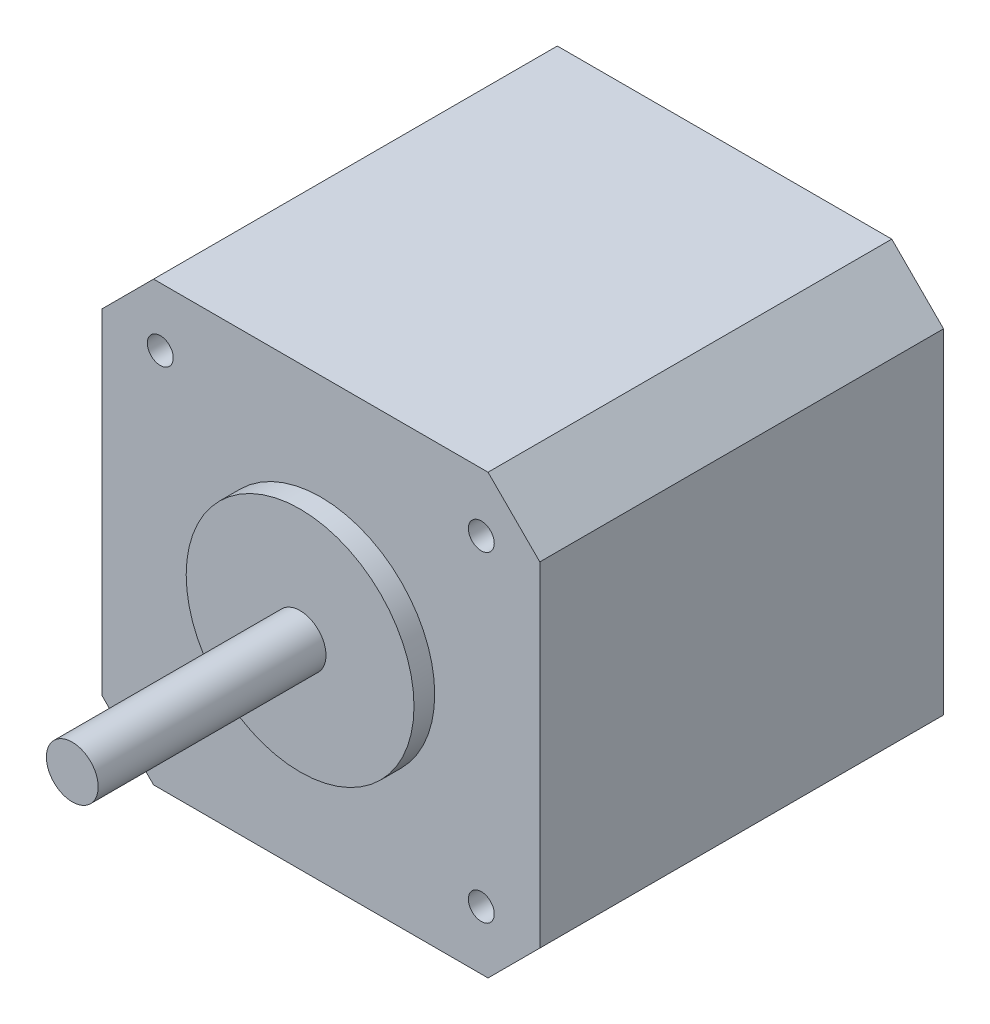
ISO-10303-21;
HEADER;
FILE_DESCRIPTION(('STEP AP214'),'2;1');
FILE_NAME('part.step','',(''),(''),'','','');
FILE_SCHEMA(('AUTOMOTIVE_DESIGN { 1 0 10303 214 1 1 1 1 }'));
ENDSEC;
DATA;
#1=APPLICATION_CONTEXT('core data for automotive mechanical design processes');
#2=APPLICATION_PROTOCOL_DEFINITION('international standard','automotive_design',2000,#1);
#3=PRODUCT_CONTEXT('',#1,'mechanical');
#4=PRODUCT('Part','Part','',(#3));
#5=PRODUCT_RELATED_PRODUCT_CATEGORY('part','',(#4));
#6=PRODUCT_DEFINITION_FORMATION('','',#4);
#7=PRODUCT_DEFINITION_CONTEXT('part definition',#1,'design');
#8=PRODUCT_DEFINITION('design','',#6,#7);
#9=PRODUCT_DEFINITION_SHAPE('','',#8);
#10=(LENGTH_UNIT() NAMED_UNIT(*) SI_UNIT(.MILLI.,.METRE.));
#11=(NAMED_UNIT(*) PLANE_ANGLE_UNIT() SI_UNIT($,.RADIAN.));
#12=(NAMED_UNIT(*) SI_UNIT($,.STERADIAN.) SOLID_ANGLE_UNIT());
#13=UNCERTAINTY_MEASURE_WITH_UNIT(LENGTH_MEASURE(1.E-05),#10,'distance_accuracy_value','');
#14=(GEOMETRIC_REPRESENTATION_CONTEXT(3) GLOBAL_UNCERTAINTY_ASSIGNED_CONTEXT((#13)) GLOBAL_UNIT_ASSIGNED_CONTEXT((#10,
#11,#12)) REPRESENTATION_CONTEXT('',''));
#15=CARTESIAN_POINT('',(0.,0.,0.));
#16=DIRECTION('',(0.,0.,1.));
#17=DIRECTION('',(1.,0.,0.));
#18=AXIS2_PLACEMENT_3D('',#15,#16,#17);
#19=CARTESIAN_POINT('',(0.,5.,38.989));
#20=DIRECTION('',(1.,0.,0.));
#21=DIRECTION('',(0.,0.,-1.));
#22=AXIS2_PLACEMENT_3D('',#19,#20,#21);
#23=PLANE('',#22);
#24=DIRECTION('',(0.,-1.,0.));
#25=VECTOR('',#24,1.);
#26=CARTESIAN_POINT('',(0.,5.,0.));
#27=LINE('',#26,#25);
#28=CARTESIAN_POINT('',(0.,37.3,0.));
#29=VERTEX_POINT('',#28);
#30=CARTESIAN_POINT('',(0.,5.,0.));
#31=VERTEX_POINT('',#30);
#32=EDGE_CURVE('E137',#29,#31,#27,.T.);
#33=ORIENTED_EDGE('',*,*,#32,.T.);
#34=DIRECTION('',(0.,0.,-1.));
#35=VECTOR('',#34,1.);
#36=CARTESIAN_POINT('',(0.,5.,38.989));
#37=LINE('',#36,#35);
#38=CARTESIAN_POINT('',(0.,5.,38.989));
#39=VERTEX_POINT('',#38);
#40=EDGE_CURVE('E45',#39,#31,#37,.T.);
#41=ORIENTED_EDGE('',*,*,#40,.F.);
#42=DIRECTION('',(0.,-1.,0.));
#43=VECTOR('',#42,1.);
#44=CARTESIAN_POINT('',(0.,5.,38.989));
#45=LINE('',#44,#43);
#46=CARTESIAN_POINT('',(0.,37.3,38.989));
#47=VERTEX_POINT('',#46);
#48=EDGE_CURVE('E152',#47,#39,#45,.T.);
#49=ORIENTED_EDGE('',*,*,#48,.F.);
#50=DIRECTION('',(0.,0.,-1.));
#51=VECTOR('',#50,1.);
#52=CARTESIAN_POINT('',(0.,37.3,38.989));
#53=LINE('',#52,#51);
#54=EDGE_CURVE('E133',#47,#29,#53,.T.);
#55=ORIENTED_EDGE('',*,*,#54,.T.);
#56=EDGE_LOOP('',(#33,#41,#49,#55));
#57=FACE_BOUND('',#56,.T.);
#58=ADVANCED_FACE('F37',(#57),#23,.F.);
#59=CARTESIAN_POINT('',(0.,5.,38.989));
#60=DIRECTION('',(0.707106781186548,0.707106781186548,0.));
#61=DIRECTION('',(-0.707106781186548,0.707106781186548,0.));
#62=AXIS2_PLACEMENT_3D('',#59,#60,#61);
#63=PLANE('',#62);
#64=DIRECTION('',(0.707106781186548,-0.707106781186548,0.));
#65=VECTOR('',#64,1.);
#66=CARTESIAN_POINT('',(0.,5.,0.));
#67=LINE('',#66,#65);
#68=CARTESIAN_POINT('',(5.,0.,0.));
#69=VERTEX_POINT('',#68);
#70=EDGE_CURVE('E140',#31,#69,#67,.T.);
#71=ORIENTED_EDGE('',*,*,#70,.T.);
#72=DIRECTION('',(0.,0.,-1.));
#73=VECTOR('',#72,1.);
#74=CARTESIAN_POINT('',(5.,0.,38.989));
#75=LINE('',#74,#73);
#76=CARTESIAN_POINT('',(5.,0.,38.989));
#77=VERTEX_POINT('',#76);
#78=EDGE_CURVE('E162',#77,#69,#75,.T.);
#79=ORIENTED_EDGE('',*,*,#78,.F.);
#80=DIRECTION('',(0.707106781186548,-0.707106781186548,0.));
#81=VECTOR('',#80,1.);
#82=CARTESIAN_POINT('',(0.,5.,38.989));
#83=LINE('',#82,#81);
#84=EDGE_CURVE('E98',#39,#77,#83,.T.);
#85=ORIENTED_EDGE('',*,*,#84,.F.);
#86=ORIENTED_EDGE('',*,*,#40,.T.);
#87=EDGE_LOOP('',(#71,#79,#85,#86));
#88=FACE_BOUND('',#87,.T.);
#89=ADVANCED_FACE('F165',(#88),#63,.F.);
#90=CARTESIAN_POINT('',(5.,0.,38.989));
#91=DIRECTION('',(0.,1.,0.));
#92=DIRECTION('',(0.,0.,1.));
#93=AXIS2_PLACEMENT_3D('',#90,#91,#92);
#94=PLANE('',#93);
#95=DIRECTION('',(1.,0.,0.));
#96=VECTOR('',#95,1.);
#97=CARTESIAN_POINT('',(5.,0.,0.));
#98=LINE('',#97,#96);
#99=CARTESIAN_POINT('',(37.3,0.,0.));
#100=VERTEX_POINT('',#99);
#101=EDGE_CURVE('E143',#69,#100,#98,.T.);
#102=ORIENTED_EDGE('',*,*,#101,.T.);
#103=DIRECTION('',(0.,0.,-1.));
#104=VECTOR('',#103,1.);
#105=CARTESIAN_POINT('',(37.3,0.,38.989));
#106=LINE('',#105,#104);
#107=CARTESIAN_POINT('',(37.3,0.,38.989));
#108=VERTEX_POINT('',#107);
#109=EDGE_CURVE('E159',#108,#100,#106,.T.);
#110=ORIENTED_EDGE('',*,*,#109,.F.);
#111=DIRECTION('',(1.,0.,0.));
#112=VECTOR('',#111,1.);
#113=CARTESIAN_POINT('',(5.,0.,38.989));
#114=LINE('',#113,#112);
#115=EDGE_CURVE('E183',#77,#108,#114,.T.);
#116=ORIENTED_EDGE('',*,*,#115,.F.);
#117=ORIENTED_EDGE('',*,*,#78,.T.);
#118=EDGE_LOOP('',(#102,#110,#116,#117));
#119=FACE_BOUND('',#118,.T.);
#120=ADVANCED_FACE('F176',(#119),#94,.F.);
#121=CARTESIAN_POINT('',(37.3,0.,38.989));
#122=DIRECTION('',(-0.707106781186548,0.707106781186547,0.));
#123=DIRECTION('',(-0.707106781186547,-0.707106781186548,0.));
#124=AXIS2_PLACEMENT_3D('',#121,#122,#123);
#125=PLANE('',#124);
#126=DIRECTION('',(0.707106781186547,0.707106781186548,0.));
#127=VECTOR('',#126,1.);
#128=CARTESIAN_POINT('',(37.3,0.,0.));
#129=LINE('',#128,#127);
#130=CARTESIAN_POINT('',(42.3,5.,0.));
#131=VERTEX_POINT('',#130);
#132=EDGE_CURVE('E145',#100,#131,#129,.T.);
#133=ORIENTED_EDGE('',*,*,#132,.T.);
#134=DIRECTION('',(0.,0.,-1.));
#135=VECTOR('',#134,1.);
#136=CARTESIAN_POINT('',(42.3,5.,38.989));
#137=LINE('',#136,#135);
#138=CARTESIAN_POINT('',(42.3,5.,38.989));
#139=VERTEX_POINT('',#138);
#140=EDGE_CURVE('E156',#139,#131,#137,.T.);
#141=ORIENTED_EDGE('',*,*,#140,.F.);
#142=DIRECTION('',(0.707106781186547,0.707106781186548,0.));
#143=VECTOR('',#142,1.);
#144=CARTESIAN_POINT('',(37.3,0.,38.989));
#145=LINE('',#144,#143);
#146=EDGE_CURVE('E182',#108,#139,#145,.T.);
#147=ORIENTED_EDGE('',*,*,#146,.F.);
#148=ORIENTED_EDGE('',*,*,#109,.T.);
#149=EDGE_LOOP('',(#133,#141,#147,#148));
#150=FACE_BOUND('',#149,.T.);
#151=ADVANCED_FACE('F180',(#150),#125,.F.);
#152=CARTESIAN_POINT('',(42.3,5.,38.989));
#153=DIRECTION('',(-1.,0.,0.));
#154=DIRECTION('',(0.,0.,1.));
#155=AXIS2_PLACEMENT_3D('',#152,#153,#154);
#156=PLANE('',#155);
#157=DIRECTION('',(0.,1.,0.));
#158=VECTOR('',#157,1.);
#159=CARTESIAN_POINT('',(42.3,5.,0.));
#160=LINE('',#159,#158);
#161=CARTESIAN_POINT('',(42.3,37.3,0.));
#162=VERTEX_POINT('',#161);
#163=EDGE_CURVE('E147',#131,#162,#160,.T.);
#164=ORIENTED_EDGE('',*,*,#163,.T.);
#165=DIRECTION('',(0.,0.,-1.));
#166=VECTOR('',#165,1.);
#167=CARTESIAN_POINT('',(42.3,37.3,38.989));
#168=LINE('',#167,#166);
#169=CARTESIAN_POINT('',(42.3,37.3,38.989));
#170=VERTEX_POINT('',#169);
#171=EDGE_CURVE('E128',#170,#162,#168,.T.);
#172=ORIENTED_EDGE('',*,*,#171,.F.);
#173=DIRECTION('',(0.,1.,0.));
#174=VECTOR('',#173,1.);
#175=CARTESIAN_POINT('',(42.3,5.,38.989));
#176=LINE('',#175,#174);
#177=EDGE_CURVE('E119',#139,#170,#176,.T.);
#178=ORIENTED_EDGE('',*,*,#177,.F.);
#179=ORIENTED_EDGE('',*,*,#140,.T.);
#180=EDGE_LOOP('',(#164,#172,#178,#179));
#181=FACE_BOUND('',#180,.T.);
#182=ADVANCED_FACE('F282',(#181),#156,.F.);
#183=CARTESIAN_POINT('',(37.3,42.3,38.989));
#184=DIRECTION('',(-0.707106781186548,-0.707106781186548,0.));
#185=DIRECTION('',(0.707106781186548,-0.707106781186548,0.));
#186=AXIS2_PLACEMENT_3D('',#183,#184,#185);
#187=PLANE('',#186);
#188=DIRECTION('',(-0.707106781186547,0.707106781186547,0.));
#189=VECTOR('',#188,1.);
#190=CARTESIAN_POINT('',(37.3,42.3,0.));
#191=LINE('',#190,#189);
#192=CARTESIAN_POINT('',(37.3,42.3,0.));
#193=VERTEX_POINT('',#192);
#194=EDGE_CURVE('E127',#162,#193,#191,.T.);
#195=ORIENTED_EDGE('',*,*,#194,.T.);
#196=DIRECTION('',(0.,0.,-1.));
#197=VECTOR('',#196,1.);
#198=CARTESIAN_POINT('',(37.3,42.3,38.989));
#199=LINE('',#198,#197);
#200=CARTESIAN_POINT('',(37.3,42.3,38.989));
#201=VERTEX_POINT('',#200);
#202=EDGE_CURVE('E124',#201,#193,#199,.T.);
#203=ORIENTED_EDGE('',*,*,#202,.F.);
#204=DIRECTION('',(-0.707106781186547,0.707106781186547,0.));
#205=VECTOR('',#204,1.);
#206=CARTESIAN_POINT('',(37.3,42.3,38.989));
#207=LINE('',#206,#205);
#208=EDGE_CURVE('E113',#170,#201,#207,.T.);
#209=ORIENTED_EDGE('',*,*,#208,.F.);
#210=ORIENTED_EDGE('',*,*,#171,.T.);
#211=EDGE_LOOP('',(#195,#203,#209,#210));
#212=FACE_BOUND('',#211,.T.);
#213=ADVANCED_FACE('F125',(#212),#187,.F.);
#214=CARTESIAN_POINT('',(5.,42.3,38.989));
#215=DIRECTION('',(0.,-1.,0.));
#216=DIRECTION('',(0.,0.,-1.));
#217=AXIS2_PLACEMENT_3D('',#214,#215,#216);
#218=PLANE('',#217);
#219=DIRECTION('',(-1.,0.,0.));
#220=VECTOR('',#219,1.);
#221=CARTESIAN_POINT('',(5.,42.3,0.));
#222=LINE('',#221,#220);
#223=CARTESIAN_POINT('',(5.,42.3,0.));
#224=VERTEX_POINT('',#223);
#225=EDGE_CURVE('E83',#193,#224,#222,.T.);
#226=ORIENTED_EDGE('',*,*,#225,.T.);
#227=DIRECTION('',(0.,0.,-1.));
#228=VECTOR('',#227,1.);
#229=CARTESIAN_POINT('',(5.,42.3,38.989));
#230=LINE('',#229,#228);
#231=CARTESIAN_POINT('',(5.,42.3,38.989));
#232=VERTEX_POINT('',#231);
#233=EDGE_CURVE('E129',#232,#224,#230,.T.);
#234=ORIENTED_EDGE('',*,*,#233,.F.);
#235=DIRECTION('',(-1.,0.,0.));
#236=VECTOR('',#235,1.);
#237=CARTESIAN_POINT('',(5.,42.3,38.989));
#238=LINE('',#237,#236);
#239=EDGE_CURVE('E117',#201,#232,#238,.T.);
#240=ORIENTED_EDGE('',*,*,#239,.F.);
#241=ORIENTED_EDGE('',*,*,#202,.T.);
#242=EDGE_LOOP('',(#226,#234,#240,#241));
#243=FACE_BOUND('',#242,.T.);
#244=ADVANCED_FACE('F131',(#243),#218,.F.);
#245=CARTESIAN_POINT('',(0.,37.3,38.989));
#246=DIRECTION('',(0.707106781186547,-0.707106781186548,0.));
#247=DIRECTION('',(0.707106781186548,0.707106781186547,0.));
#248=AXIS2_PLACEMENT_3D('',#245,#246,#247);
#249=PLANE('',#248);
#250=DIRECTION('',(-0.707106781186548,-0.707106781186547,0.));
#251=VECTOR('',#250,1.);
#252=CARTESIAN_POINT('',(0.,37.3,0.));
#253=LINE('',#252,#251);
#254=EDGE_CURVE('E89',#224,#29,#253,.T.);
#255=ORIENTED_EDGE('',*,*,#254,.T.);
#256=ORIENTED_EDGE('',*,*,#54,.F.);
#257=DIRECTION('',(-0.707106781186548,-0.707106781186547,0.));
#258=VECTOR('',#257,1.);
#259=CARTESIAN_POINT('',(0.,37.3,38.989));
#260=LINE('',#259,#258);
#261=EDGE_CURVE('E53',#232,#47,#260,.T.);
#262=ORIENTED_EDGE('',*,*,#261,.F.);
#263=ORIENTED_EDGE('',*,*,#233,.T.);
#264=EDGE_LOOP('',(#255,#256,#262,#263));
#265=FACE_BOUND('',#264,.T.);
#266=ADVANCED_FACE('F245',(#265),#249,.F.);
#267=CARTESIAN_POINT('',(0.,0.,38.989));
#268=DIRECTION('',(0.,0.,-1.));
#269=DIRECTION('',(-1.,0.,0.));
#270=AXIS2_PLACEMENT_3D('',#267,#268,#269);
#271=PLANE('',#270);
#272=CARTESIAN_POINT('',(21.15,21.15,38.989));
#273=DIRECTION('',(0.,0.,-1.));
#274=DIRECTION('',(-1.,0.,0.));
#275=AXIS2_PLACEMENT_3D('',#272,#273,#274);
#276=CIRCLE('',#275,11.);
#277=CARTESIAN_POINT('',(10.15,21.15,38.989));
#278=VERTEX_POINT('',#277);
#279=EDGE_CURVE('E11',#278,#278,#276,.F.);
#280=ORIENTED_EDGE('',*,*,#279,.F.);
#281=EDGE_LOOP('',(#280));
#282=FACE_BOUND('',#281,.T.);
#283=CARTESIAN_POINT('',(5.65,36.65,38.989));
#284=DIRECTION('',(0.,0.,1.));
#285=DIRECTION('',(1.,0.,0.));
#286=AXIS2_PLACEMENT_3D('',#283,#284,#285);
#287=CIRCLE('',#286,1.25);
#288=CARTESIAN_POINT('',(6.9,36.65,38.989));
#289=VERTEX_POINT('',#288);
#290=EDGE_CURVE('E209',#289,#289,#287,.T.);
#291=ORIENTED_EDGE('',*,*,#290,.F.);
#292=EDGE_LOOP('',(#291));
#293=FACE_BOUND('',#292,.T.);
#294=CARTESIAN_POINT('',(36.65,36.65,38.989));
#295=DIRECTION('',(0.,0.,1.));
#296=DIRECTION('',(1.,0.,0.));
#297=AXIS2_PLACEMENT_3D('',#294,#295,#296);
#298=CIRCLE('',#297,1.25);
#299=CARTESIAN_POINT('',(37.9,36.65,38.989));
#300=VERTEX_POINT('',#299);
#301=EDGE_CURVE('E203',#300,#300,#298,.T.);
#302=ORIENTED_EDGE('',*,*,#301,.F.);
#303=EDGE_LOOP('',(#302));
#304=FACE_BOUND('',#303,.T.);
#305=CARTESIAN_POINT('',(36.65,5.65,38.989));
#306=DIRECTION('',(0.,0.,1.));
#307=DIRECTION('',(1.,0.,0.));
#308=AXIS2_PLACEMENT_3D('',#305,#306,#307);
#309=CIRCLE('',#308,1.25);
#310=CARTESIAN_POINT('',(37.9,5.65,38.989));
#311=VERTEX_POINT('',#310);
#312=EDGE_CURVE('E197',#311,#311,#309,.T.);
#313=ORIENTED_EDGE('',*,*,#312,.F.);
#314=EDGE_LOOP('',(#313));
#315=FACE_BOUND('',#314,.T.);
#316=CARTESIAN_POINT('',(5.65,5.65,38.989));
#317=DIRECTION('',(0.,0.,1.));
#318=DIRECTION('',(1.,0.,0.));
#319=AXIS2_PLACEMENT_3D('',#316,#317,#318);
#320=CIRCLE('',#319,1.25);
#321=CARTESIAN_POINT('',(6.9,5.65,38.989));
#322=VERTEX_POINT('',#321);
#323=EDGE_CURVE('E191',#322,#322,#320,.T.);
#324=ORIENTED_EDGE('',*,*,#323,.F.);
#325=EDGE_LOOP('',(#324));
#326=FACE_BOUND('',#325,.T.);
#327=ORIENTED_EDGE('',*,*,#48,.T.);
#328=ORIENTED_EDGE('',*,*,#84,.T.);
#329=ORIENTED_EDGE('',*,*,#115,.T.);
#330=ORIENTED_EDGE('',*,*,#146,.T.);
#331=ORIENTED_EDGE('',*,*,#177,.T.);
#332=ORIENTED_EDGE('',*,*,#208,.T.);
#333=ORIENTED_EDGE('',*,*,#239,.T.);
#334=ORIENTED_EDGE('',*,*,#261,.T.);
#335=EDGE_LOOP('',(#327,#328,#329,#330,#331,#332,#333,#334));
#336=FACE_BOUND('',#335,.T.);
#337=ADVANCED_FACE('F115',(#282,#293,#304,#315,#326,#336),#271,.F.);
#338=CARTESIAN_POINT('',(0.,0.,0.));
#339=DIRECTION('',(0.,0.,-1.));
#340=DIRECTION('',(-1.,0.,0.));
#341=AXIS2_PLACEMENT_3D('',#338,#339,#340);
#342=PLANE('',#341);
#343=ORIENTED_EDGE('',*,*,#32,.F.);
#344=ORIENTED_EDGE('',*,*,#254,.F.);
#345=ORIENTED_EDGE('',*,*,#225,.F.);
#346=ORIENTED_EDGE('',*,*,#194,.F.);
#347=ORIENTED_EDGE('',*,*,#163,.F.);
#348=ORIENTED_EDGE('',*,*,#132,.F.);
#349=ORIENTED_EDGE('',*,*,#101,.F.);
#350=ORIENTED_EDGE('',*,*,#70,.F.);
#351=EDGE_LOOP('',(#343,#344,#345,#346,#347,#348,#349,#350));
#352=FACE_BOUND('',#351,.T.);
#353=ADVANCED_FACE('F170',(#352),#342,.T.);
#354=CARTESIAN_POINT('',(5.65,5.65,33.989));
#355=DIRECTION('',(0.,0.,1.));
#356=DIRECTION('',(1.,0.,0.));
#357=AXIS2_PLACEMENT_3D('',#354,#355,#356);
#358=CONICAL_SURFACE('',#357,1.25,1.02974425867665);
#359=CARTESIAN_POINT('',(5.65,5.65,33.2379242262155));
#360=VERTEX_POINT('',#359);
#361=VERTEX_LOOP('',#360);
#362=FACE_BOUND('',#361,.T.);
#363=CARTESIAN_POINT('',(5.65,5.65,33.989));
#364=DIRECTION('',(0.,0.,1.));
#365=DIRECTION('',(1.,0.,0.));
#366=AXIS2_PLACEMENT_3D('',#363,#364,#365);
#367=CIRCLE('',#366,1.25);
#368=CARTESIAN_POINT('',(6.9,5.65,33.989));
#369=VERTEX_POINT('',#368);
#370=EDGE_CURVE('E141',#369,#369,#367,.T.);
#371=ORIENTED_EDGE('',*,*,#370,.T.);
#372=EDGE_LOOP('',(#371));
#373=FACE_BOUND('',#372,.T.);
#374=ADVANCED_FACE('F258',(#362,#373),#358,.F.);
#375=CARTESIAN_POINT('',(5.65,5.65,38.989));
#376=DIRECTION('',(0.,0.,1.));
#377=DIRECTION('',(1.,0.,0.));
#378=AXIS2_PLACEMENT_3D('',#375,#376,#377);
#379=CYLINDRICAL_SURFACE('',#378,1.25);
#380=ORIENTED_EDGE('',*,*,#370,.F.);
#381=EDGE_LOOP('',(#380));
#382=FACE_BOUND('',#381,.T.);
#383=ORIENTED_EDGE('',*,*,#323,.T.);
#384=EDGE_LOOP('',(#383));
#385=FACE_BOUND('',#384,.T.);
#386=ADVANCED_FACE('F255',(#382,#385),#379,.F.);
#387=CARTESIAN_POINT('',(36.65,5.65,33.989));
#388=DIRECTION('',(0.,0.,1.));
#389=DIRECTION('',(1.,0.,0.));
#390=AXIS2_PLACEMENT_3D('',#387,#388,#389);
#391=CONICAL_SURFACE('',#390,1.25,1.02974425867666);
#392=CARTESIAN_POINT('',(36.65,5.65,33.2379242262155));
#393=VERTEX_POINT('',#392);
#394=VERTEX_LOOP('',#393);
#395=FACE_BOUND('',#394,.T.);
#396=CARTESIAN_POINT('',(36.65,5.65,33.989));
#397=DIRECTION('',(0.,0.,1.));
#398=DIRECTION('',(1.,0.,0.));
#399=AXIS2_PLACEMENT_3D('',#396,#397,#398);
#400=CIRCLE('',#399,1.25);
#401=CARTESIAN_POINT('',(37.9,5.65,33.989));
#402=VERTEX_POINT('',#401);
#403=EDGE_CURVE('E194',#402,#402,#400,.T.);
#404=ORIENTED_EDGE('',*,*,#403,.T.);
#405=EDGE_LOOP('',(#404));
#406=FACE_BOUND('',#405,.T.);
#407=ADVANCED_FACE('F257',(#395,#406),#391,.F.);
#408=CARTESIAN_POINT('',(36.65,5.65,38.989));
#409=DIRECTION('',(0.,0.,1.));
#410=DIRECTION('',(1.,0.,0.));
#411=AXIS2_PLACEMENT_3D('',#408,#409,#410);
#412=CYLINDRICAL_SURFACE('',#411,1.25);
#413=ORIENTED_EDGE('',*,*,#403,.F.);
#414=EDGE_LOOP('',(#413));
#415=FACE_BOUND('',#414,.T.);
#416=ORIENTED_EDGE('',*,*,#312,.T.);
#417=EDGE_LOOP('',(#416));
#418=FACE_BOUND('',#417,.T.);
#419=ADVANCED_FACE('F265',(#415,#418),#412,.F.);
#420=CARTESIAN_POINT('',(36.65,36.65,33.989));
#421=DIRECTION('',(0.,0.,1.));
#422=DIRECTION('',(1.,0.,0.));
#423=AXIS2_PLACEMENT_3D('',#420,#421,#422);
#424=CONICAL_SURFACE('',#423,1.25,1.02974425867666);
#425=CARTESIAN_POINT('',(36.65,36.65,33.2379242262155));
#426=VERTEX_POINT('',#425);
#427=VERTEX_LOOP('',#426);
#428=FACE_BOUND('',#427,.T.);
#429=CARTESIAN_POINT('',(36.65,36.65,33.989));
#430=DIRECTION('',(0.,0.,1.));
#431=DIRECTION('',(1.,0.,0.));
#432=AXIS2_PLACEMENT_3D('',#429,#430,#431);
#433=CIRCLE('',#432,1.25);
#434=CARTESIAN_POINT('',(37.9,36.65,33.989));
#435=VERTEX_POINT('',#434);
#436=EDGE_CURVE('E200',#435,#435,#433,.T.);
#437=ORIENTED_EDGE('',*,*,#436,.T.);
#438=EDGE_LOOP('',(#437));
#439=FACE_BOUND('',#438,.T.);
#440=ADVANCED_FACE('F324',(#428,#439),#424,.F.);
#441=CARTESIAN_POINT('',(36.65,36.65,38.989));
#442=DIRECTION('',(0.,0.,1.));
#443=DIRECTION('',(1.,0.,0.));
#444=AXIS2_PLACEMENT_3D('',#441,#442,#443);
#445=CYLINDRICAL_SURFACE('',#444,1.25);
#446=ORIENTED_EDGE('',*,*,#436,.F.);
#447=EDGE_LOOP('',(#446));
#448=FACE_BOUND('',#447,.T.);
#449=ORIENTED_EDGE('',*,*,#301,.T.);
#450=EDGE_LOOP('',(#449));
#451=FACE_BOUND('',#450,.T.);
#452=ADVANCED_FACE('F335',(#448,#451),#445,.F.);
#453=CARTESIAN_POINT('',(5.65,36.65,33.989));
#454=DIRECTION('',(0.,0.,1.));
#455=DIRECTION('',(1.,0.,0.));
#456=AXIS2_PLACEMENT_3D('',#453,#454,#455);
#457=CONICAL_SURFACE('',#456,1.25,1.02974425867665);
#458=CARTESIAN_POINT('',(5.65,36.65,33.2379242262155));
#459=VERTEX_POINT('',#458);
#460=VERTEX_LOOP('',#459);
#461=FACE_BOUND('',#460,.T.);
#462=CARTESIAN_POINT('',(5.65,36.65,33.989));
#463=DIRECTION('',(0.,0.,1.));
#464=DIRECTION('',(1.,0.,0.));
#465=AXIS2_PLACEMENT_3D('',#462,#463,#464);
#466=CIRCLE('',#465,1.25);
#467=CARTESIAN_POINT('',(6.9,36.65,33.989));
#468=VERTEX_POINT('',#467);
#469=EDGE_CURVE('E206',#468,#468,#466,.T.);
#470=ORIENTED_EDGE('',*,*,#469,.T.);
#471=EDGE_LOOP('',(#470));
#472=FACE_BOUND('',#471,.T.);
#473=ADVANCED_FACE('F345',(#461,#472),#457,.F.);
#474=CARTESIAN_POINT('',(5.65,36.65,38.989));
#475=DIRECTION('',(0.,0.,1.));
#476=DIRECTION('',(1.,0.,0.));
#477=AXIS2_PLACEMENT_3D('',#474,#475,#476);
#478=CYLINDRICAL_SURFACE('',#477,1.25);
#479=ORIENTED_EDGE('',*,*,#469,.F.);
#480=EDGE_LOOP('',(#479));
#481=FACE_BOUND('',#480,.T.);
#482=ORIENTED_EDGE('',*,*,#290,.T.);
#483=EDGE_LOOP('',(#482));
#484=FACE_BOUND('',#483,.T.);
#485=ADVANCED_FACE('F239',(#481,#484),#478,.F.);
#486=CARTESIAN_POINT('',(21.15,21.15,40.989));
#487=DIRECTION('',(0.,0.,-1.));
#488=DIRECTION('',(-1.,0.,0.));
#489=AXIS2_PLACEMENT_3D('',#486,#487,#488);
#490=CYLINDRICAL_SURFACE('',#489,11.);
#491=CARTESIAN_POINT('',(21.15,21.15,40.989));
#492=DIRECTION('',(0.,0.,1.));
#493=DIRECTION('',(1.,0.,0.));
#494=AXIS2_PLACEMENT_3D('',#491,#492,#493);
#495=CIRCLE('',#494,11.);
#496=CARTESIAN_POINT('',(32.15,21.15,40.989));
#497=VERTEX_POINT('',#496);
#498=EDGE_CURVE('E212',#497,#497,#495,.T.);
#499=ORIENTED_EDGE('',*,*,#498,.F.);
#500=EDGE_LOOP('',(#499));
#501=FACE_BOUND('',#500,.T.);
#502=ORIENTED_EDGE('',*,*,#279,.T.);
#503=EDGE_LOOP('',(#502));
#504=FACE_BOUND('',#503,.T.);
#505=ADVANCED_FACE('F233',(#501,#504),#490,.T.);
#506=CARTESIAN_POINT('',(21.15,21.15,40.989));
#507=DIRECTION('',(0.,0.,1.));
#508=DIRECTION('',(1.,0.,0.));
#509=AXIS2_PLACEMENT_3D('',#506,#507,#508);
#510=PLANE('',#509);
#511=CARTESIAN_POINT('',(21.15,21.15,40.989));
#512=DIRECTION('',(0.,0.,1.));
#513=DIRECTION('',(1.,0.,0.));
#514=AXIS2_PLACEMENT_3D('',#511,#512,#513);
#515=CIRCLE('',#514,2.5);
#516=CARTESIAN_POINT('',(23.65,21.15,40.989));
#517=VERTEX_POINT('',#516);
#518=EDGE_CURVE('E216',#517,#517,#515,.T.);
#519=ORIENTED_EDGE('',*,*,#518,.F.);
#520=EDGE_LOOP('',(#519));
#521=FACE_BOUND('',#520,.T.);
#522=ORIENTED_EDGE('',*,*,#498,.T.);
#523=EDGE_LOOP('',(#522));
#524=FACE_BOUND('',#523,.T.);
#525=ADVANCED_FACE('F227',(#521,#524),#510,.T.);
#526=CARTESIAN_POINT('',(21.15,21.15,62.989));
#527=DIRECTION('',(0.,0.,-1.));
#528=DIRECTION('',(-1.,0.,0.));
#529=AXIS2_PLACEMENT_3D('',#526,#527,#528);
#530=CYLINDRICAL_SURFACE('',#529,2.5);
#531=CARTESIAN_POINT('',(21.15,21.15,62.989));
#532=DIRECTION('',(0.,0.,1.));
#533=DIRECTION('',(1.,0.,0.));
#534=AXIS2_PLACEMENT_3D('',#531,#532,#533);
#535=CIRCLE('',#534,2.5);
#536=CARTESIAN_POINT('',(23.65,21.15,62.989));
#537=VERTEX_POINT('',#536);
#538=EDGE_CURVE('E215',#537,#537,#535,.T.);
#539=ORIENTED_EDGE('',*,*,#538,.F.);
#540=EDGE_LOOP('',(#539));
#541=FACE_BOUND('',#540,.T.);
#542=ORIENTED_EDGE('',*,*,#518,.T.);
#543=EDGE_LOOP('',(#542));
#544=FACE_BOUND('',#543,.T.);
#545=ADVANCED_FACE('F224',(#541,#544),#530,.T.);
#546=CARTESIAN_POINT('',(21.15,21.15,62.989));
#547=DIRECTION('',(0.,0.,1.));
#548=DIRECTION('',(1.,0.,0.));
#549=AXIS2_PLACEMENT_3D('',#546,#547,#548);
#550=PLANE('',#549);
#551=ORIENTED_EDGE('',*,*,#538,.T.);
#552=EDGE_LOOP('',(#551));
#553=FACE_BOUND('',#552,.T.);
#554=ADVANCED_FACE('F222',(#553),#550,.T.);
#555=CLOSED_SHELL('',(#58,#89,#120,#151,#182,#213,#244,#266,#337,#353,#374,#386,#407,#419,#440,
#452,#473,#485,#505,#525,#545,#554));
#556=MANIFOLD_SOLID_BREP('B2',#555);
#557=ADVANCED_BREP_SHAPE_REPRESENTATION('',(#18,#556),#14);
#558=SHAPE_DEFINITION_REPRESENTATION(#9,#557);
ENDSEC;
END-ISO-10303-21;
